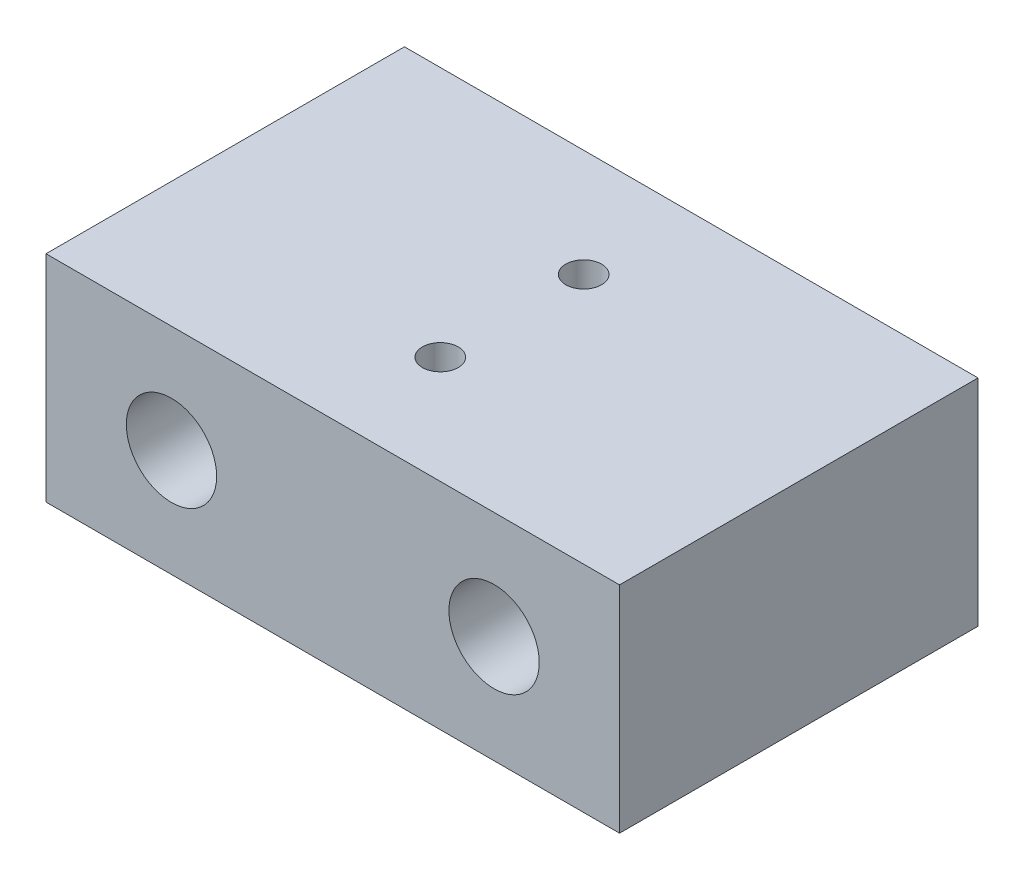
ISO-10303-21;
HEADER;
FILE_DESCRIPTION(('STEP AP214'),'2;1');
FILE_NAME('part.step','',(''),(''),'','','');
FILE_SCHEMA(('AUTOMOTIVE_DESIGN { 1 0 10303 214 1 1 1 1 }'));
ENDSEC;
DATA;
#1=APPLICATION_CONTEXT('core data for automotive mechanical design processes');
#2=APPLICATION_PROTOCOL_DEFINITION('international standard','automotive_design',2000,#1);
#3=PRODUCT_CONTEXT('',#1,'mechanical');
#4=PRODUCT('Part','Part','',(#3));
#5=PRODUCT_RELATED_PRODUCT_CATEGORY('part','',(#4));
#6=PRODUCT_DEFINITION_FORMATION('','',#4);
#7=PRODUCT_DEFINITION_CONTEXT('part definition',#1,'design');
#8=PRODUCT_DEFINITION('design','',#6,#7);
#9=PRODUCT_DEFINITION_SHAPE('','',#8);
#10=(LENGTH_UNIT() NAMED_UNIT(*) SI_UNIT(.MILLI.,.METRE.));
#11=(NAMED_UNIT(*) PLANE_ANGLE_UNIT() SI_UNIT($,.RADIAN.));
#12=(NAMED_UNIT(*) SI_UNIT($,.STERADIAN.) SOLID_ANGLE_UNIT());
#13=UNCERTAINTY_MEASURE_WITH_UNIT(LENGTH_MEASURE(1.E-05),#10,'distance_accuracy_value','');
#14=(GEOMETRIC_REPRESENTATION_CONTEXT(3) GLOBAL_UNCERTAINTY_ASSIGNED_CONTEXT((#13)) GLOBAL_UNIT_ASSIGNED_CONTEXT((#10,
#11,#12)) REPRESENTATION_CONTEXT('',''));
#15=CARTESIAN_POINT('',(0.,0.,0.));
#16=DIRECTION('',(0.,0.,1.));
#17=DIRECTION('',(1.,0.,0.));
#18=AXIS2_PLACEMENT_3D('',#15,#16,#17);
#19=CARTESIAN_POINT('',(0.,0.,31.75));
#20=DIRECTION('',(0.,0.,-1.));
#21=DIRECTION('',(-1.,0.,0.));
#22=AXIS2_PLACEMENT_3D('',#19,#20,#21);
#23=PLANE('',#22);
#24=DIRECTION('',(0.,1.,0.));
#25=VECTOR('',#24,1.);
#26=CARTESIAN_POINT('',(25.4,-9.525,31.75));
#27=LINE('',#26,#25);
#28=CARTESIAN_POINT('',(25.4,-9.525,31.75));
#29=VERTEX_POINT('',#28);
#30=CARTESIAN_POINT('',(25.4,9.525,31.75));
#31=VERTEX_POINT('',#30);
#32=EDGE_CURVE('E84',#29,#31,#27,.T.);
#33=ORIENTED_EDGE('',*,*,#32,.T.);
#34=DIRECTION('',(-1.,0.,0.));
#35=VECTOR('',#34,1.);
#36=CARTESIAN_POINT('',(-25.4,9.525,31.75));
#37=LINE('',#36,#35);
#38=CARTESIAN_POINT('',(-25.4,9.525,31.75));
#39=VERTEX_POINT('',#38);
#40=EDGE_CURVE('E79',#31,#39,#37,.T.);
#41=ORIENTED_EDGE('',*,*,#40,.T.);
#42=DIRECTION('',(0.,-1.,0.));
#43=VECTOR('',#42,1.);
#44=CARTESIAN_POINT('',(-25.4,-9.525,31.75));
#45=LINE('',#44,#43);
#46=CARTESIAN_POINT('',(-25.4,-9.525,31.75));
#47=VERTEX_POINT('',#46);
#48=EDGE_CURVE('E82',#39,#47,#45,.T.);
#49=ORIENTED_EDGE('',*,*,#48,.T.);
#50=DIRECTION('',(1.,0.,0.));
#51=VECTOR('',#50,1.);
#52=CARTESIAN_POINT('',(-25.4,-9.525,31.75));
#53=LINE('',#52,#51);
#54=EDGE_CURVE('E49',#47,#29,#53,.T.);
#55=ORIENTED_EDGE('',*,*,#54,.T.);
#56=EDGE_LOOP('',(#33,#41,#49,#55));
#57=FACE_BOUND('',#56,.T.);
#58=CARTESIAN_POINT('',(-14.2875,0.,31.75));
#59=DIRECTION('',(0.,0.,1.));
#60=DIRECTION('',(1.,0.,0.));
#61=AXIS2_PLACEMENT_3D('',#58,#59,#60);
#62=CIRCLE('',#61,4.);
#63=CARTESIAN_POINT('',(-10.2875,0.,31.75));
#64=VERTEX_POINT('',#63);
#65=EDGE_CURVE('E99',#64,#64,#62,.T.);
#66=ORIENTED_EDGE('',*,*,#65,.F.);
#67=EDGE_LOOP('',(#66));
#68=FACE_BOUND('',#67,.T.);
#69=CARTESIAN_POINT('',(14.2875,0.,31.75));
#70=DIRECTION('',(0.,0.,1.));
#71=DIRECTION('',(1.,0.,0.));
#72=AXIS2_PLACEMENT_3D('',#69,#70,#71);
#73=CIRCLE('',#72,4.);
#74=CARTESIAN_POINT('',(18.2875,0.,31.75));
#75=VERTEX_POINT('',#74);
#76=EDGE_CURVE('E114',#75,#75,#73,.T.);
#77=ORIENTED_EDGE('',*,*,#76,.F.);
#78=EDGE_LOOP('',(#77));
#79=FACE_BOUND('',#78,.T.);
#80=ADVANCED_FACE('F32',(#57,#68,#79),#23,.F.);
#81=CARTESIAN_POINT('',(0.,0.,0.));
#82=DIRECTION('',(0.,0.,-1.));
#83=DIRECTION('',(-1.,0.,0.));
#84=AXIS2_PLACEMENT_3D('',#81,#82,#83);
#85=PLANE('',#84);
#86=CARTESIAN_POINT('',(-14.2875,0.,0.));
#87=DIRECTION('',(0.,0.,1.));
#88=DIRECTION('',(1.,0.,0.));
#89=AXIS2_PLACEMENT_3D('',#86,#87,#88);
#90=CIRCLE('',#89,4.);
#91=CARTESIAN_POINT('',(-10.2875,0.,0.));
#92=VERTEX_POINT('',#91);
#93=EDGE_CURVE('E111',#92,#92,#90,.T.);
#94=ORIENTED_EDGE('',*,*,#93,.T.);
#95=EDGE_LOOP('',(#94));
#96=FACE_BOUND('',#95,.T.);
#97=DIRECTION('',(0.,1.,0.));
#98=VECTOR('',#97,1.);
#99=CARTESIAN_POINT('',(25.4,-9.525,0.));
#100=LINE('',#99,#98);
#101=CARTESIAN_POINT('',(25.4,-9.525,0.));
#102=VERTEX_POINT('',#101);
#103=CARTESIAN_POINT('',(25.4,9.525,0.));
#104=VERTEX_POINT('',#103);
#105=EDGE_CURVE('E96',#102,#104,#100,.T.);
#106=ORIENTED_EDGE('',*,*,#105,.F.);
#107=DIRECTION('',(1.,0.,0.));
#108=VECTOR('',#107,1.);
#109=CARTESIAN_POINT('',(-25.4,-9.525,0.));
#110=LINE('',#109,#108);
#111=CARTESIAN_POINT('',(-25.4,-9.525,0.));
#112=VERTEX_POINT('',#111);
#113=EDGE_CURVE('E72',#112,#102,#110,.T.);
#114=ORIENTED_EDGE('',*,*,#113,.F.);
#115=DIRECTION('',(0.,-1.,0.));
#116=VECTOR('',#115,1.);
#117=CARTESIAN_POINT('',(-25.4,-9.525,0.));
#118=LINE('',#117,#116);
#119=CARTESIAN_POINT('',(-25.4,9.525,0.));
#120=VERTEX_POINT('',#119);
#121=EDGE_CURVE('E66',#120,#112,#118,.T.);
#122=ORIENTED_EDGE('',*,*,#121,.F.);
#123=DIRECTION('',(-1.,0.,0.));
#124=VECTOR('',#123,1.);
#125=CARTESIAN_POINT('',(-25.4,9.525,0.));
#126=LINE('',#125,#124);
#127=EDGE_CURVE('E88',#104,#120,#126,.T.);
#128=ORIENTED_EDGE('',*,*,#127,.F.);
#129=EDGE_LOOP('',(#106,#114,#122,#128));
#130=FACE_BOUND('',#129,.T.);
#131=CARTESIAN_POINT('',(14.2875,0.,0.));
#132=DIRECTION('',(0.,0.,1.));
#133=DIRECTION('',(1.,0.,0.));
#134=AXIS2_PLACEMENT_3D('',#131,#132,#133);
#135=CIRCLE('',#134,4.);
#136=CARTESIAN_POINT('',(18.2875,0.,0.));
#137=VERTEX_POINT('',#136);
#138=EDGE_CURVE('E117',#137,#137,#135,.T.);
#139=ORIENTED_EDGE('',*,*,#138,.T.);
#140=EDGE_LOOP('',(#139));
#141=FACE_BOUND('',#140,.T.);
#142=ADVANCED_FACE('F107',(#96,#130,#141),#85,.T.);
#143=CARTESIAN_POINT('',(25.4,-9.525,31.75));
#144=DIRECTION('',(-1.,0.,0.));
#145=DIRECTION('',(0.,0.,1.));
#146=AXIS2_PLACEMENT_3D('',#143,#144,#145);
#147=PLANE('',#146);
#148=ORIENTED_EDGE('',*,*,#105,.T.);
#149=DIRECTION('',(0.,0.,-1.));
#150=VECTOR('',#149,1.);
#151=CARTESIAN_POINT('',(25.4,9.525,31.75));
#152=LINE('',#151,#150);
#153=EDGE_CURVE('E11',#31,#104,#152,.T.);
#154=ORIENTED_EDGE('',*,*,#153,.F.);
#155=ORIENTED_EDGE('',*,*,#32,.F.);
#156=DIRECTION('',(0.,0.,-1.));
#157=VECTOR('',#156,1.);
#158=CARTESIAN_POINT('',(25.4,-9.525,31.75));
#159=LINE('',#158,#157);
#160=EDGE_CURVE('E92',#29,#102,#159,.T.);
#161=ORIENTED_EDGE('',*,*,#160,.T.);
#162=EDGE_LOOP('',(#148,#154,#155,#161));
#163=FACE_BOUND('',#162,.T.);
#164=ADVANCED_FACE('F34',(#163),#147,.F.);
#165=CARTESIAN_POINT('',(-25.4,9.525,31.75));
#166=DIRECTION('',(0.,-1.,0.));
#167=DIRECTION('',(0.,0.,-1.));
#168=AXIS2_PLACEMENT_3D('',#165,#166,#167);
#169=PLANE('',#168);
#170=CARTESIAN_POINT('',(0.,9.525,22.225));
#171=DIRECTION('',(0.,1.,0.));
#172=DIRECTION('',(0.,0.,1.));
#173=AXIS2_PLACEMENT_3D('',#170,#171,#172);
#174=CIRCLE('',#173,1.5875);
#175=CARTESIAN_POINT('',(0.,9.525,23.8125));
#176=VERTEX_POINT('',#175);
#177=EDGE_CURVE('E129',#176,#176,#174,.T.);
#178=ORIENTED_EDGE('',*,*,#177,.F.);
#179=EDGE_LOOP('',(#178));
#180=FACE_BOUND('',#179,.T.);
#181=CARTESIAN_POINT('',(0.,9.525,9.525));
#182=DIRECTION('',(0.,1.,0.));
#183=DIRECTION('',(0.,0.,1.));
#184=AXIS2_PLACEMENT_3D('',#181,#182,#183);
#185=CIRCLE('',#184,1.5875);
#186=CARTESIAN_POINT('',(0.,9.525,11.1125));
#187=VERTEX_POINT('',#186);
#188=EDGE_CURVE('E123',#187,#187,#185,.T.);
#189=ORIENTED_EDGE('',*,*,#188,.F.);
#190=EDGE_LOOP('',(#189));
#191=FACE_BOUND('',#190,.T.);
#192=ORIENTED_EDGE('',*,*,#127,.T.);
#193=DIRECTION('',(0.,0.,-1.));
#194=VECTOR('',#193,1.);
#195=CARTESIAN_POINT('',(-25.4,9.525,31.75));
#196=LINE('',#195,#194);
#197=EDGE_CURVE('E41',#39,#120,#196,.T.);
#198=ORIENTED_EDGE('',*,*,#197,.F.);
#199=ORIENTED_EDGE('',*,*,#40,.F.);
#200=ORIENTED_EDGE('',*,*,#153,.T.);
#201=EDGE_LOOP('',(#192,#198,#199,#200));
#202=FACE_BOUND('',#201,.T.);
#203=ADVANCED_FACE('F87',(#180,#191,#202),#169,.F.);
#204=CARTESIAN_POINT('',(-25.4,-9.525,31.75));
#205=DIRECTION('',(1.,0.,0.));
#206=DIRECTION('',(0.,0.,-1.));
#207=AXIS2_PLACEMENT_3D('',#204,#205,#206);
#208=PLANE('',#207);
#209=ORIENTED_EDGE('',*,*,#121,.T.);
#210=DIRECTION('',(0.,0.,-1.));
#211=VECTOR('',#210,1.);
#212=CARTESIAN_POINT('',(-25.4,-9.525,31.75));
#213=LINE('',#212,#211);
#214=EDGE_CURVE('E89',#47,#112,#213,.T.);
#215=ORIENTED_EDGE('',*,*,#214,.F.);
#216=ORIENTED_EDGE('',*,*,#48,.F.);
#217=ORIENTED_EDGE('',*,*,#197,.T.);
#218=EDGE_LOOP('',(#209,#215,#216,#217));
#219=FACE_BOUND('',#218,.T.);
#220=ADVANCED_FACE('F90',(#219),#208,.F.);
#221=CARTESIAN_POINT('',(-25.4,-9.525,31.75));
#222=DIRECTION('',(0.,1.,0.));
#223=DIRECTION('',(0.,0.,1.));
#224=AXIS2_PLACEMENT_3D('',#221,#222,#223);
#225=PLANE('',#224);
#226=CARTESIAN_POINT('',(0.,-9.525,22.225));
#227=DIRECTION('',(0.,1.,0.));
#228=DIRECTION('',(0.,0.,1.));
#229=AXIS2_PLACEMENT_3D('',#226,#227,#228);
#230=CIRCLE('',#229,1.5875);
#231=CARTESIAN_POINT('',(0.,-9.525,23.8125));
#232=VERTEX_POINT('',#231);
#233=EDGE_CURVE('E126',#232,#232,#230,.T.);
#234=ORIENTED_EDGE('',*,*,#233,.T.);
#235=EDGE_LOOP('',(#234));
#236=FACE_BOUND('',#235,.T.);
#237=CARTESIAN_POINT('',(0.,-9.525,9.525));
#238=DIRECTION('',(0.,1.,0.));
#239=DIRECTION('',(0.,0.,1.));
#240=AXIS2_PLACEMENT_3D('',#237,#238,#239);
#241=CIRCLE('',#240,1.5875);
#242=CARTESIAN_POINT('',(0.,-9.525,11.1125));
#243=VERTEX_POINT('',#242);
#244=EDGE_CURVE('E120',#243,#243,#241,.T.);
#245=ORIENTED_EDGE('',*,*,#244,.T.);
#246=EDGE_LOOP('',(#245));
#247=FACE_BOUND('',#246,.T.);
#248=ORIENTED_EDGE('',*,*,#113,.T.);
#249=ORIENTED_EDGE('',*,*,#160,.F.);
#250=ORIENTED_EDGE('',*,*,#54,.F.);
#251=ORIENTED_EDGE('',*,*,#214,.T.);
#252=EDGE_LOOP('',(#248,#249,#250,#251));
#253=FACE_BOUND('',#252,.T.);
#254=ADVANCED_FACE('F104',(#236,#247,#253),#225,.F.);
#255=CARTESIAN_POINT('',(-14.2875,0.,31.75));
#256=DIRECTION('',(0.,0.,-1.));
#257=DIRECTION('',(-1.,0.,0.));
#258=AXIS2_PLACEMENT_3D('',#255,#256,#257);
#259=CYLINDRICAL_SURFACE('',#258,4.);
#260=ORIENTED_EDGE('',*,*,#65,.T.);
#261=EDGE_LOOP('',(#260));
#262=FACE_BOUND('',#261,.T.);
#263=ORIENTED_EDGE('',*,*,#93,.F.);
#264=EDGE_LOOP('',(#263));
#265=FACE_BOUND('',#264,.T.);
#266=ADVANCED_FACE('F155',(#262,#265),#259,.F.);
#267=CARTESIAN_POINT('',(14.2875,0.,31.75));
#268=DIRECTION('',(0.,0.,-1.));
#269=DIRECTION('',(-1.,0.,0.));
#270=AXIS2_PLACEMENT_3D('',#267,#268,#269);
#271=CYLINDRICAL_SURFACE('',#270,4.);
#272=ORIENTED_EDGE('',*,*,#76,.T.);
#273=EDGE_LOOP('',(#272));
#274=FACE_BOUND('',#273,.T.);
#275=ORIENTED_EDGE('',*,*,#138,.F.);
#276=EDGE_LOOP('',(#275));
#277=FACE_BOUND('',#276,.T.);
#278=ADVANCED_FACE('F149',(#274,#277),#271,.F.);
#279=CARTESIAN_POINT('',(0.,-9.525,9.525));
#280=DIRECTION('',(0.,1.,0.));
#281=DIRECTION('',(0.,0.,1.));
#282=AXIS2_PLACEMENT_3D('',#279,#280,#281);
#283=CYLINDRICAL_SURFACE('',#282,1.5875);
#284=CARTESIAN_POINT('',(0.,-9.525,11.1125));
#285=CARTESIAN_POINT('',(0.,-9.3265625,11.1125));
#286=CARTESIAN_POINT('',(0.,-9.128125,11.1125));
#287=CARTESIAN_POINT('',(0.,-8.73125,11.1125));
#288=CARTESIAN_POINT('',(0.,-8.5328125,11.1125));
#289=CARTESIAN_POINT('',(0.,-8.1359375,11.1125));
#290=CARTESIAN_POINT('',(0.,-7.9375,11.1125));
#291=CARTESIAN_POINT('',(0.,-7.540625,11.1125));
#292=CARTESIAN_POINT('',(0.,-7.3421875,11.1125));
#293=CARTESIAN_POINT('',(0.,-6.9453125,11.1125));
#294=CARTESIAN_POINT('',(0.,-6.746875,11.1125));
#295=CARTESIAN_POINT('',(0.,-6.35,11.1125));
#296=CARTESIAN_POINT('',(0.,-6.1515625,11.1125));
#297=CARTESIAN_POINT('',(0.,-5.7546875,11.1125));
#298=CARTESIAN_POINT('',(0.,-5.55625,11.1125));
#299=CARTESIAN_POINT('',(0.,-5.159375,11.1125));
#300=CARTESIAN_POINT('',(0.,-4.9609375,11.1125));
#301=CARTESIAN_POINT('',(0.,-4.5640625,11.1125));
#302=CARTESIAN_POINT('',(0.,-4.365625,11.1125));
#303=CARTESIAN_POINT('',(0.,-3.96875,11.1125));
#304=CARTESIAN_POINT('',(0.,-3.7703125,11.1125));
#305=CARTESIAN_POINT('',(0.,-3.3734375,11.1125));
#306=CARTESIAN_POINT('',(0.,-3.175,11.1125));
#307=CARTESIAN_POINT('',(0.,-2.778125,11.1125));
#308=CARTESIAN_POINT('',(0.,-2.5796875,11.1125));
#309=CARTESIAN_POINT('',(0.,-2.1828125,11.1125));
#310=CARTESIAN_POINT('',(0.,-1.984375,11.1125));
#311=CARTESIAN_POINT('',(0.,-1.5875,11.1125));
#312=CARTESIAN_POINT('',(0.,-1.3890625,11.1125));
#313=CARTESIAN_POINT('',(0.,-0.992187500000002,11.1125));
#314=CARTESIAN_POINT('',(0.,-0.793750000000002,11.1125));
#315=CARTESIAN_POINT('',(0.,-0.396875000000002,11.1125));
#316=CARTESIAN_POINT('',(0.,-0.198437500000002,11.1125));
#317=CARTESIAN_POINT('',(0.,0.198437499999998,11.1125));
#318=CARTESIAN_POINT('',(0.,0.396874999999998,11.1125));
#319=CARTESIAN_POINT('',(0.,0.793749999999999,11.1125));
#320=CARTESIAN_POINT('',(0.,0.992187499999999,11.1125));
#321=CARTESIAN_POINT('',(0.,1.3890625,11.1125));
#322=CARTESIAN_POINT('',(0.,1.5875,11.1125));
#323=CARTESIAN_POINT('',(0.,1.984375,11.1125));
#324=CARTESIAN_POINT('',(0.,2.1828125,11.1125));
#325=CARTESIAN_POINT('',(0.,2.5796875,11.1125));
#326=CARTESIAN_POINT('',(0.,2.778125,11.1125));
#327=CARTESIAN_POINT('',(0.,3.175,11.1125));
#328=CARTESIAN_POINT('',(0.,3.3734375,11.1125));
#329=CARTESIAN_POINT('',(0.,3.7703125,11.1125));
#330=CARTESIAN_POINT('',(0.,3.96875,11.1125));
#331=CARTESIAN_POINT('',(0.,4.365625,11.1125));
#332=CARTESIAN_POINT('',(0.,4.5640625,11.1125));
#333=CARTESIAN_POINT('',(0.,4.9609375,11.1125));
#334=CARTESIAN_POINT('',(0.,5.159375,11.1125));
#335=CARTESIAN_POINT('',(0.,5.55625,11.1125));
#336=CARTESIAN_POINT('',(0.,5.7546875,11.1125));
#337=CARTESIAN_POINT('',(0.,6.1515625,11.1125));
#338=CARTESIAN_POINT('',(0.,6.35,11.1125));
#339=CARTESIAN_POINT('',(0.,6.746875,11.1125));
#340=CARTESIAN_POINT('',(0.,6.9453125,11.1125));
#341=CARTESIAN_POINT('',(0.,7.3421875,11.1125));
#342=CARTESIAN_POINT('',(0.,7.540625,11.1125));
#343=CARTESIAN_POINT('',(0.,7.9375,11.1125));
#344=CARTESIAN_POINT('',(0.,8.1359375,11.1125));
#345=CARTESIAN_POINT('',(0.,8.5328125,11.1125));
#346=CARTESIAN_POINT('',(0.,8.73125,11.1125));
#347=CARTESIAN_POINT('',(0.,9.128125,11.1125));
#348=CARTESIAN_POINT('',(0.,9.3265625,11.1125));
#349=CARTESIAN_POINT('',(0.,9.525,11.1125));
#350=B_SPLINE_CURVE_WITH_KNOTS('',3,(#284,#285,#286,#287,#288,#289,#290,#291,#292,#293,#294,
#295,#296,#297,#298,#299,#300,#301,#302,#303,#304,#305,#306,#307,#308,#309,#310,#311,#312,#313,
#314,#315,#316,#317,#318,#319,#320,#321,#322,#323,#324,#325,#326,#327,#328,#329,#330,#331,#332,
#333,#334,#335,#336,#337,#338,#339,#340,#341,#342,#343,#344,#345,#346,#347,#348,#349),
.UNSPECIFIED.,.F.,.F.,(4,2,2,2,2,2,2,2,2,2,2,2,2,2,2,2,2,2,2,2,2,2,2,2,2,2,2,2,2,2,2,2,4),(0.,
0.5953125,1.190625,1.7859375,2.38125,2.9765625,3.571875,4.1671875,4.7625,5.3578125,5.953125,
6.5484375,7.14375,7.7390625,8.334375,8.9296875,9.525,10.1203125,10.715625,11.3109375,11.90625,
12.5015625,13.096875,13.6921875,14.2875,14.8828125,15.478125,16.0734375,16.66875,17.2640625,
17.859375,18.4546875,19.05),.UNSPECIFIED.);
#351=EDGE_CURVE('BSEAM140',#243,#187,#350,.T.);
#352=ORIENTED_EDGE('',*,*,#244,.F.);
#353=ORIENTED_EDGE('',*,*,#188,.T.);
#354=ORIENTED_EDGE('',*,*,#351,.T.);
#355=ORIENTED_EDGE('',*,*,#351,.F.);
#356=EDGE_LOOP('',(#352,#354,#353,#355));
#357=FACE_BOUND('',#356,.T.);
#358=ADVANCED_FACE('F140',(#357),#283,.F.);
#359=CARTESIAN_POINT('',(0.,-9.525,22.225));
#360=DIRECTION('',(0.,1.,0.));
#361=DIRECTION('',(0.,0.,1.));
#362=AXIS2_PLACEMENT_3D('',#359,#360,#361);
#363=CYLINDRICAL_SURFACE('',#362,1.5875);
#364=CARTESIAN_POINT('',(0.,-9.525,23.8125));
#365=CARTESIAN_POINT('',(0.,-9.3265625,23.8125));
#366=CARTESIAN_POINT('',(0.,-9.128125,23.8125));
#367=CARTESIAN_POINT('',(0.,-8.73125,23.8125));
#368=CARTESIAN_POINT('',(0.,-8.5328125,23.8125));
#369=CARTESIAN_POINT('',(0.,-8.1359375,23.8125));
#370=CARTESIAN_POINT('',(0.,-7.9375,23.8125));
#371=CARTESIAN_POINT('',(0.,-7.540625,23.8125));
#372=CARTESIAN_POINT('',(0.,-7.3421875,23.8125));
#373=CARTESIAN_POINT('',(0.,-6.9453125,23.8125));
#374=CARTESIAN_POINT('',(0.,-6.746875,23.8125));
#375=CARTESIAN_POINT('',(0.,-6.35,23.8125));
#376=CARTESIAN_POINT('',(0.,-6.1515625,23.8125));
#377=CARTESIAN_POINT('',(0.,-5.7546875,23.8125));
#378=CARTESIAN_POINT('',(0.,-5.55625,23.8125));
#379=CARTESIAN_POINT('',(0.,-5.159375,23.8125));
#380=CARTESIAN_POINT('',(0.,-4.9609375,23.8125));
#381=CARTESIAN_POINT('',(0.,-4.5640625,23.8125));
#382=CARTESIAN_POINT('',(0.,-4.365625,23.8125));
#383=CARTESIAN_POINT('',(0.,-3.96875,23.8125));
#384=CARTESIAN_POINT('',(0.,-3.7703125,23.8125));
#385=CARTESIAN_POINT('',(0.,-3.3734375,23.8125));
#386=CARTESIAN_POINT('',(0.,-3.175,23.8125));
#387=CARTESIAN_POINT('',(0.,-2.778125,23.8125));
#388=CARTESIAN_POINT('',(0.,-2.5796875,23.8125));
#389=CARTESIAN_POINT('',(0.,-2.1828125,23.8125));
#390=CARTESIAN_POINT('',(0.,-1.984375,23.8125));
#391=CARTESIAN_POINT('',(0.,-1.5875,23.8125));
#392=CARTESIAN_POINT('',(0.,-1.3890625,23.8125));
#393=CARTESIAN_POINT('',(0.,-0.992187500000002,23.8125));
#394=CARTESIAN_POINT('',(0.,-0.793750000000002,23.8125));
#395=CARTESIAN_POINT('',(0.,-0.396875000000002,23.8125));
#396=CARTESIAN_POINT('',(0.,-0.198437500000002,23.8125));
#397=CARTESIAN_POINT('',(0.,0.198437499999998,23.8125));
#398=CARTESIAN_POINT('',(0.,0.396874999999998,23.8125));
#399=CARTESIAN_POINT('',(0.,0.793749999999999,23.8125));
#400=CARTESIAN_POINT('',(0.,0.992187499999999,23.8125));
#401=CARTESIAN_POINT('',(0.,1.3890625,23.8125));
#402=CARTESIAN_POINT('',(0.,1.5875,23.8125));
#403=CARTESIAN_POINT('',(0.,1.984375,23.8125));
#404=CARTESIAN_POINT('',(0.,2.1828125,23.8125));
#405=CARTESIAN_POINT('',(0.,2.5796875,23.8125));
#406=CARTESIAN_POINT('',(0.,2.778125,23.8125));
#407=CARTESIAN_POINT('',(0.,3.175,23.8125));
#408=CARTESIAN_POINT('',(0.,3.3734375,23.8125));
#409=CARTESIAN_POINT('',(0.,3.7703125,23.8125));
#410=CARTESIAN_POINT('',(0.,3.96875,23.8125));
#411=CARTESIAN_POINT('',(0.,4.365625,23.8125));
#412=CARTESIAN_POINT('',(0.,4.5640625,23.8125));
#413=CARTESIAN_POINT('',(0.,4.9609375,23.8125));
#414=CARTESIAN_POINT('',(0.,5.159375,23.8125));
#415=CARTESIAN_POINT('',(0.,5.55625,23.8125));
#416=CARTESIAN_POINT('',(0.,5.7546875,23.8125));
#417=CARTESIAN_POINT('',(0.,6.1515625,23.8125));
#418=CARTESIAN_POINT('',(0.,6.35,23.8125));
#419=CARTESIAN_POINT('',(0.,6.746875,23.8125));
#420=CARTESIAN_POINT('',(0.,6.9453125,23.8125));
#421=CARTESIAN_POINT('',(0.,7.3421875,23.8125));
#422=CARTESIAN_POINT('',(0.,7.540625,23.8125));
#423=CARTESIAN_POINT('',(0.,7.9375,23.8125));
#424=CARTESIAN_POINT('',(0.,8.1359375,23.8125));
#425=CARTESIAN_POINT('',(0.,8.5328125,23.8125));
#426=CARTESIAN_POINT('',(0.,8.73125,23.8125));
#427=CARTESIAN_POINT('',(0.,9.128125,23.8125));
#428=CARTESIAN_POINT('',(0.,9.3265625,23.8125));
#429=CARTESIAN_POINT('',(0.,9.525,23.8125));
#430=B_SPLINE_CURVE_WITH_KNOTS('',3,(#364,#365,#366,#367,#368,#369,#370,#371,#372,#373,#374,
#375,#376,#377,#378,#379,#380,#381,#382,#383,#384,#385,#386,#387,#388,#389,#390,#391,#392,#393,
#394,#395,#396,#397,#398,#399,#400,#401,#402,#403,#404,#405,#406,#407,#408,#409,#410,#411,#412,
#413,#414,#415,#416,#417,#418,#419,#420,#421,#422,#423,#424,#425,#426,#427,#428,#429),
.UNSPECIFIED.,.F.,.F.,(4,2,2,2,2,2,2,2,2,2,2,2,2,2,2,2,2,2,2,2,2,2,2,2,2,2,2,2,2,2,2,2,4),(0.,
0.5953125,1.190625,1.7859375,2.38125,2.9765625,3.571875,4.1671875,4.7625,5.3578125,5.953125,
6.5484375,7.14375,7.7390625,8.334375,8.9296875,9.525,10.1203125,10.715625,11.3109375,11.90625,
12.5015625,13.096875,13.6921875,14.2875,14.8828125,15.478125,16.0734375,16.66875,17.2640625,
17.859375,18.4546875,19.05),.UNSPECIFIED.);
#431=EDGE_CURVE('BSEAM137',#232,#176,#430,.T.);
#432=ORIENTED_EDGE('',*,*,#233,.F.);
#433=ORIENTED_EDGE('',*,*,#177,.T.);
#434=ORIENTED_EDGE('',*,*,#431,.T.);
#435=ORIENTED_EDGE('',*,*,#431,.F.);
#436=EDGE_LOOP('',(#432,#434,#433,#435));
#437=FACE_BOUND('',#436,.T.);
#438=ADVANCED_FACE('F137',(#437),#363,.F.);
#439=CLOSED_SHELL('',(#80,#142,#164,#203,#220,#254,#266,#278,#358,#438));
#440=MANIFOLD_SOLID_BREP('B2',#439);
#441=ADVANCED_BREP_SHAPE_REPRESENTATION('',(#18,#440),#14);
#442=SHAPE_DEFINITION_REPRESENTATION(#9,#441);
ENDSEC;
END-ISO-10303-21;
